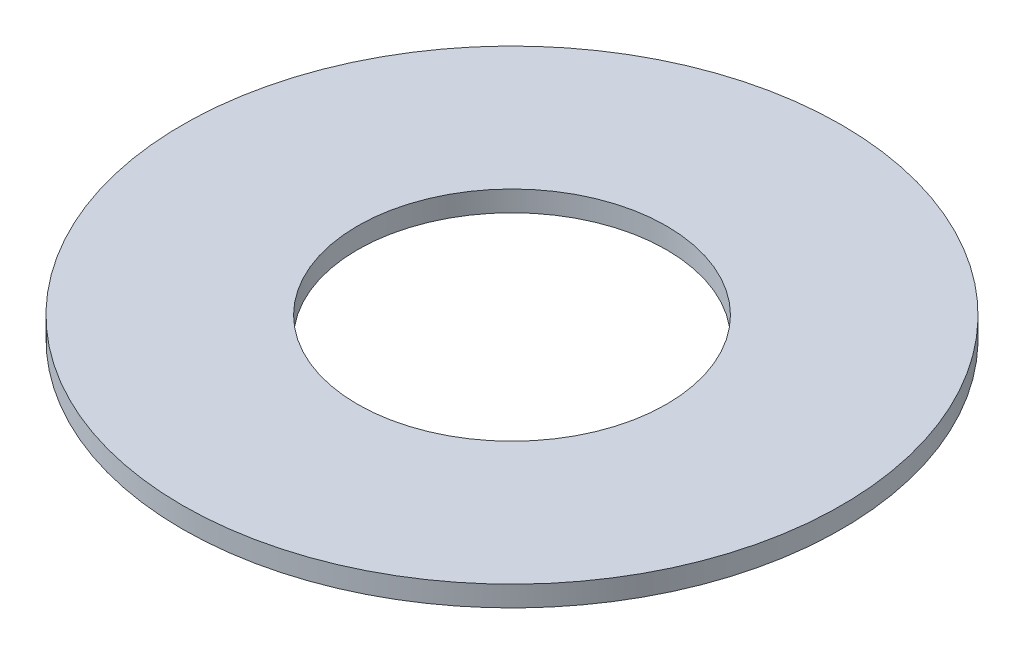
ISO-10303-21;
HEADER;
FILE_DESCRIPTION(('STEP AP214'),'2;1');
FILE_NAME('part.step','',(''),(''),'','','');
FILE_SCHEMA(('AUTOMOTIVE_DESIGN { 1 0 10303 214 1 1 1 1 }'));
ENDSEC;
DATA;
#1=APPLICATION_CONTEXT('core data for automotive mechanical design processes');
#2=APPLICATION_PROTOCOL_DEFINITION('international standard','automotive_design',2000,#1);
#3=PRODUCT_CONTEXT('',#1,'mechanical');
#4=PRODUCT('Part','Part','',(#3));
#5=PRODUCT_RELATED_PRODUCT_CATEGORY('part','',(#4));
#6=PRODUCT_DEFINITION_FORMATION('','',#4);
#7=PRODUCT_DEFINITION_CONTEXT('part definition',#1,'design');
#8=PRODUCT_DEFINITION('design','',#6,#7);
#9=PRODUCT_DEFINITION_SHAPE('','',#8);
#10=(LENGTH_UNIT() NAMED_UNIT(*) SI_UNIT(.MILLI.,.METRE.));
#11=(NAMED_UNIT(*) PLANE_ANGLE_UNIT() SI_UNIT($,.RADIAN.));
#12=(NAMED_UNIT(*) SI_UNIT($,.STERADIAN.) SOLID_ANGLE_UNIT());
#13=UNCERTAINTY_MEASURE_WITH_UNIT(LENGTH_MEASURE(1.E-05),#10,'distance_accuracy_value','');
#14=(GEOMETRIC_REPRESENTATION_CONTEXT(3) GLOBAL_UNCERTAINTY_ASSIGNED_CONTEXT((#13)) GLOBAL_UNIT_ASSIGNED_CONTEXT((#10,
#11,#12)) REPRESENTATION_CONTEXT('',''));
#15=CARTESIAN_POINT('',(0.,0.,0.));
#16=DIRECTION('',(0.,0.,1.));
#17=DIRECTION('',(1.,0.,0.));
#18=AXIS2_PLACEMENT_3D('',#15,#16,#17);
#19=CARTESIAN_POINT('',(0.,1.,0.));
#20=DIRECTION('',(0.,1.,0.));
#21=DIRECTION('',(0.,0.,1.));
#22=AXIS2_PLACEMENT_3D('',#19,#20,#21);
#23=PLANE('',#22);
#24=CARTESIAN_POINT('',(0.,1.,0.));
#25=DIRECTION('',(0.,1.,0.));
#26=DIRECTION('',(0.,0.,1.));
#27=AXIS2_PLACEMENT_3D('',#24,#25,#26);
#28=CIRCLE('',#27,16.);
#29=CARTESIAN_POINT('',(0.,1.,16.));
#30=VERTEX_POINT('',#29);
#31=EDGE_CURVE('E12',#30,#30,#28,.T.);
#32=ORIENTED_EDGE('',*,*,#31,.T.);
#33=EDGE_LOOP('',(#32));
#34=FACE_BOUND('',#33,.T.);
#35=CARTESIAN_POINT('',(0.,1.,0.));
#36=DIRECTION('',(0.,1.,0.));
#37=DIRECTION('',(0.,0.,1.));
#38=AXIS2_PLACEMENT_3D('',#35,#36,#37);
#39=CIRCLE('',#38,7.5);
#40=CARTESIAN_POINT('',(0.,1.,7.5));
#41=VERTEX_POINT('',#40);
#42=EDGE_CURVE('E56',#41,#41,#39,.T.);
#43=ORIENTED_EDGE('',*,*,#42,.F.);
#44=EDGE_LOOP('',(#43));
#45=FACE_BOUND('',#44,.T.);
#46=ADVANCED_FACE('F45',(#34,#45),#23,.T.);
#47=CARTESIAN_POINT('',(0.,0.,0.));
#48=DIRECTION('',(0.,1.,0.));
#49=DIRECTION('',(0.,0.,1.));
#50=AXIS2_PLACEMENT_3D('',#47,#48,#49);
#51=PLANE('',#50);
#52=CARTESIAN_POINT('',(0.,0.,0.));
#53=DIRECTION('',(0.,1.,0.));
#54=DIRECTION('',(0.,0.,1.));
#55=AXIS2_PLACEMENT_3D('',#52,#53,#54);
#56=CIRCLE('',#55,16.);
#57=CARTESIAN_POINT('',(0.,0.,16.));
#58=VERTEX_POINT('',#57);
#59=EDGE_CURVE('E49',#58,#58,#56,.T.);
#60=ORIENTED_EDGE('',*,*,#59,.F.);
#61=EDGE_LOOP('',(#60));
#62=FACE_BOUND('',#61,.T.);
#63=CARTESIAN_POINT('',(0.,0.,0.));
#64=DIRECTION('',(0.,1.,0.));
#65=DIRECTION('',(0.,0.,1.));
#66=AXIS2_PLACEMENT_3D('',#63,#64,#65);
#67=CIRCLE('',#66,7.5);
#68=CARTESIAN_POINT('',(0.,0.,7.5));
#69=VERTEX_POINT('',#68);
#70=EDGE_CURVE('E58',#69,#69,#67,.T.);
#71=ORIENTED_EDGE('',*,*,#70,.T.);
#72=EDGE_LOOP('',(#71));
#73=FACE_BOUND('',#72,.T.);
#74=ADVANCED_FACE('F68',(#62,#73),#51,.F.);
#75=CARTESIAN_POINT('',(0.,1.,0.));
#76=DIRECTION('',(0.,-1.,0.));
#77=DIRECTION('',(0.,0.,-1.));
#78=AXIS2_PLACEMENT_3D('',#75,#76,#77);
#79=CYLINDRICAL_SURFACE('',#78,16.);
#80=ORIENTED_EDGE('',*,*,#31,.F.);
#81=EDGE_LOOP('',(#80));
#82=FACE_BOUND('',#81,.T.);
#83=ORIENTED_EDGE('',*,*,#59,.T.);
#84=EDGE_LOOP('',(#83));
#85=FACE_BOUND('',#84,.T.);
#86=ADVANCED_FACE('F47',(#82,#85),#79,.T.);
#87=CARTESIAN_POINT('',(0.,1.,0.));
#88=DIRECTION('',(0.,-1.,0.));
#89=DIRECTION('',(0.,0.,-1.));
#90=AXIS2_PLACEMENT_3D('',#87,#88,#89);
#91=CYLINDRICAL_SURFACE('',#90,7.5);
#92=ORIENTED_EDGE('',*,*,#42,.T.);
#93=EDGE_LOOP('',(#92));
#94=FACE_BOUND('',#93,.T.);
#95=ORIENTED_EDGE('',*,*,#70,.F.);
#96=EDGE_LOOP('',(#95));
#97=FACE_BOUND('',#96,.T.);
#98=ADVANCED_FACE('F64',(#94,#97),#91,.F.);
#99=CLOSED_SHELL('',(#46,#74,#86,#98));
#100=MANIFOLD_SOLID_BREP('B2',#99);
#101=ADVANCED_BREP_SHAPE_REPRESENTATION('',(#18,#100),#14);
#102=SHAPE_DEFINITION_REPRESENTATION(#9,#101);
ENDSEC;
END-ISO-10303-21;
